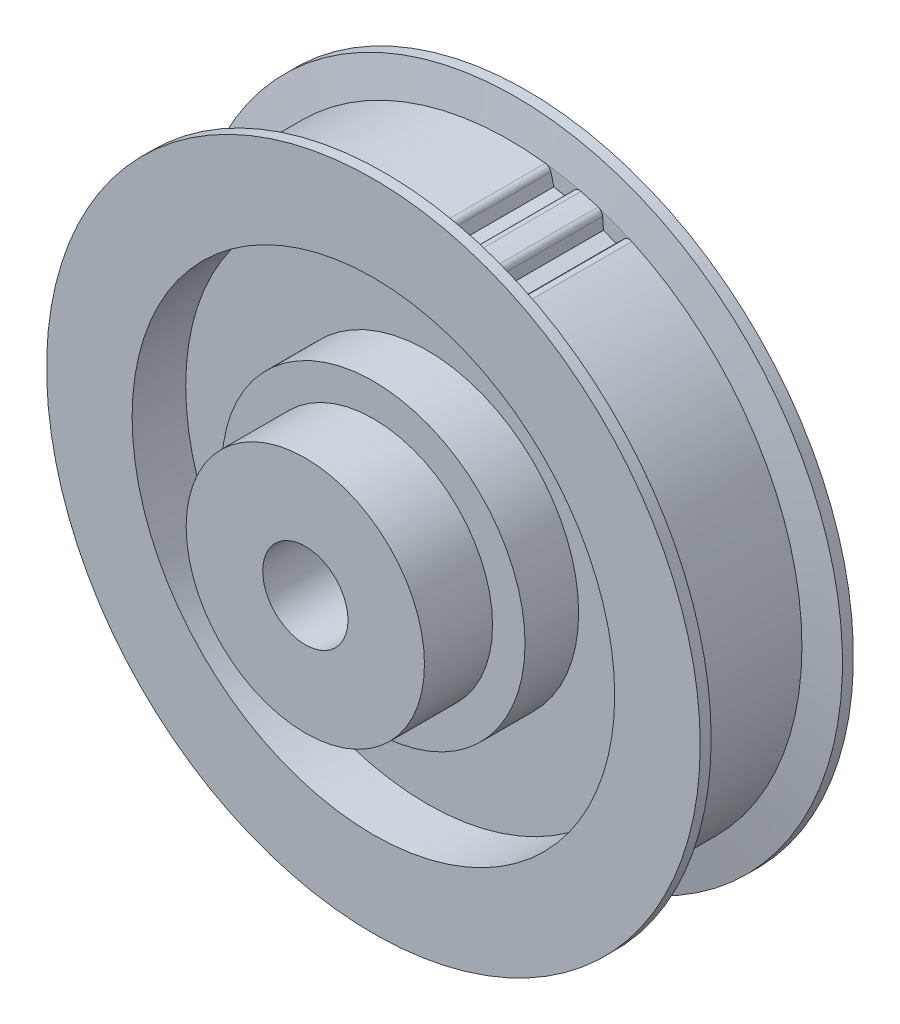
ISO-10303-21;
HEADER;
FILE_DESCRIPTION(('STEP AP214'),'2;1');
FILE_NAME('part.step','',(''),(''),'','','');
FILE_SCHEMA(('AUTOMOTIVE_DESIGN { 1 0 10303 214 1 1 1 1 }'));
ENDSEC;
DATA;
#1=APPLICATION_CONTEXT('core data for automotive mechanical design processes');
#2=APPLICATION_PROTOCOL_DEFINITION('international standard','automotive_design',2000,#1);
#3=PRODUCT_CONTEXT('',#1,'mechanical');
#4=PRODUCT('Part','Part','',(#3));
#5=PRODUCT_RELATED_PRODUCT_CATEGORY('part','',(#4));
#6=PRODUCT_DEFINITION_FORMATION('','',#4);
#7=PRODUCT_DEFINITION_CONTEXT('part definition',#1,'design');
#8=PRODUCT_DEFINITION('design','',#6,#7);
#9=PRODUCT_DEFINITION_SHAPE('','',#8);
#10=(LENGTH_UNIT() NAMED_UNIT(*) SI_UNIT(.MILLI.,.METRE.));
#11=(NAMED_UNIT(*) PLANE_ANGLE_UNIT() SI_UNIT($,.RADIAN.));
#12=(NAMED_UNIT(*) SI_UNIT($,.STERADIAN.) SOLID_ANGLE_UNIT());
#13=UNCERTAINTY_MEASURE_WITH_UNIT(LENGTH_MEASURE(1.E-05),#10,'distance_accuracy_value','');
#14=(GEOMETRIC_REPRESENTATION_CONTEXT(3) GLOBAL_UNCERTAINTY_ASSIGNED_CONTEXT((#13)) GLOBAL_UNIT_ASSIGNED_CONTEXT((#10,
#11,#12)) REPRESENTATION_CONTEXT('',''));
#15=CARTESIAN_POINT('',(0.,0.,0.));
#16=DIRECTION('',(0.,0.,1.));
#17=DIRECTION('',(1.,0.,0.));
#18=AXIS2_PLACEMENT_3D('',#15,#16,#17);
#19=CARTESIAN_POINT('',(0.,0.,-6.73508684388624));
#20=DIRECTION('',(0.,0.,1.));
#21=DIRECTION('',(1.,0.,0.));
#22=AXIS2_PLACEMENT_3D('',#19,#20,#21);
#23=CYLINDRICAL_SURFACE('',#22,27.2669);
#24=CARTESIAN_POINT('',(0.,0.,-5.55625));
#25=DIRECTION('',(0.,0.,1.));
#26=DIRECTION('',(1.,0.,0.));
#27=AXIS2_PLACEMENT_3D('',#24,#25,#26);
#28=CIRCLE('',#27,27.2669);
#29=CARTESIAN_POINT('',(8.25638364092266,25.9868421471985,-5.5562499999977));
#30=VERTEX_POINT('',#29);
#31=CARTESIAN_POINT('',(6.66059066724126,26.4408843946918,-5.55625));
#32=VERTEX_POINT('',#31);
#33=EDGE_CURVE('E275',#30,#32,#28,.T.);
#34=ORIENTED_EDGE('',*,*,#33,.T.);
#35=DIRECTION('',(0.,0.,1.));
#36=VECTOR('',#35,1.);
#37=CARTESIAN_POINT('',(6.66059066724126,26.4408843946918,-6.73508684388624));
#38=LINE('',#37,#36);
#39=CARTESIAN_POINT('',(6.66059066724329,26.4408843946999,5.55625000000076));
#40=VERTEX_POINT('',#39);
#41=EDGE_CURVE('E229',#32,#40,#38,.T.);
#42=ORIENTED_EDGE('',*,*,#41,.T.);
#43=CARTESIAN_POINT('',(0.,0.,5.55625));
#44=DIRECTION('',(0.,0.,1.));
#45=DIRECTION('',(1.,0.,0.));
#46=AXIS2_PLACEMENT_3D('',#43,#44,#45);
#47=CIRCLE('',#46,27.2669);
#48=CARTESIAN_POINT('',(8.2563836409254,25.9868421472071,5.55625));
#49=VERTEX_POINT('',#48);
#50=EDGE_CURVE('E277',#40,#49,#47,.F.);
#51=ORIENTED_EDGE('',*,*,#50,.T.);
#52=DIRECTION('',(0.,0.,1.));
#53=VECTOR('',#52,1.);
#54=CARTESIAN_POINT('',(8.2563836409254,25.9868421472071,-6.73508684388624));
#55=LINE('',#54,#53);
#56=EDGE_CURVE('E214',#49,#30,#55,.F.);
#57=ORIENTED_EDGE('',*,*,#56,.T.);
#58=EDGE_LOOP('',(#34,#42,#51,#57));
#59=FACE_BOUND('',#58,.T.);
#60=ADVANCED_FACE('F36',(#59),#23,.T.);
#61=CARTESIAN_POINT('',(6.0159422493335,26.204511819853,-5.55625));
#62=DIRECTION('',(0.813220272875712,-0.581956001587708,0.));
#63=DIRECTION('',(0.581956001587708,0.813220272875712,0.));
#64=AXIS2_PLACEMENT_3D('',#61,#62,#63);
#65=PLANE('',#64);
#66=DIRECTION('',(0.581956001587708,0.813220272875712,0.));
#67=VECTOR('',#66,1.);
#68=CARTESIAN_POINT('',(6.0159422493335,26.204511819853,5.55625));
#69=LINE('',#68,#67);
#70=CARTESIAN_POINT('',(6.01594224933983,26.2045118198618,5.55625));
#71=VERTEX_POINT('',#70);
#72=CARTESIAN_POINT('',(5.37776956926434,25.3127348476969,5.55625));
#73=VERTEX_POINT('',#72);
#74=EDGE_CURVE('E209',#71,#73,#69,.F.);
#75=ORIENTED_EDGE('',*,*,#74,.F.);
#76=DIRECTION('',(0.,0.,-1.));
#77=VECTOR('',#76,1.);
#78=CARTESIAN_POINT('',(6.01594224933983,26.2045118198618,-5.55625));
#79=LINE('',#78,#77);
#80=CARTESIAN_POINT('',(6.01594224933983,26.2045118198618,-5.55625));
#81=VERTEX_POINT('',#80);
#82=EDGE_CURVE('E223',#71,#81,#79,.T.);
#83=ORIENTED_EDGE('',*,*,#82,.T.);
#84=DIRECTION('',(0.581956001587708,0.813220272875712,0.));
#85=VECTOR('',#84,1.);
#86=CARTESIAN_POINT('',(6.0159422493335,26.204511819853,-5.55625));
#87=LINE('',#86,#85);
#88=CARTESIAN_POINT('',(5.37776956926434,25.3127348476969,-5.55625));
#89=VERTEX_POINT('',#88);
#90=EDGE_CURVE('E226',#89,#81,#87,.T.);
#91=ORIENTED_EDGE('',*,*,#90,.F.);
#92=DIRECTION('',(0.,0.,1.));
#93=VECTOR('',#92,1.);
#94=CARTESIAN_POINT('',(5.37776956926282,25.312734847698,-5.55625));
#95=LINE('',#94,#93);
#96=EDGE_CURVE('E177',#89,#73,#95,.T.);
#97=ORIENTED_EDGE('',*,*,#96,.T.);
#98=EDGE_LOOP('',(#75,#83,#91,#97));
#99=FACE_BOUND('',#98,.T.);
#100=ADVANCED_FACE('F290',(#99),#65,.F.);
#101=CARTESIAN_POINT('',(8.7531659144231,24.3523517854962,-5.55625));
#102=DIRECTION('',(-0.997774167736922,-0.0666836576448315,0.));
#103=DIRECTION('',(0.0666836576448315,-0.997774167736922,0.));
#104=AXIS2_PLACEMENT_3D('',#101,#102,#103);
#105=PLANE('',#104);
#106=DIRECTION('',(0.0666836576448315,-0.997774167736922,0.));
#107=VECTOR('',#106,1.);
#108=CARTESIAN_POINT('',(8.7531659144231,24.3523517854962,-5.55625));
#109=LINE('',#108,#107);
#110=CARTESIAN_POINT('',(8.68004064653338,25.4465104727388,-5.55625));
#111=VERTEX_POINT('',#110);
#112=CARTESIAN_POINT('',(8.75316591442325,24.3523517854966,-5.55625));
#113=VERTEX_POINT('',#112);
#114=EDGE_CURVE('E128',#111,#113,#109,.T.);
#115=ORIENTED_EDGE('',*,*,#114,.F.);
#116=DIRECTION('',(0.,0.,-1.));
#117=VECTOR('',#116,1.);
#118=CARTESIAN_POINT('',(8.68004064653338,25.4465104727388,5.55625));
#119=LINE('',#118,#117);
#120=CARTESIAN_POINT('',(8.68004064653338,25.4465104727388,5.55625));
#121=VERTEX_POINT('',#120);
#122=EDGE_CURVE('E211',#111,#121,#119,.F.);
#123=ORIENTED_EDGE('',*,*,#122,.T.);
#124=DIRECTION('',(0.0666836576448315,-0.997774167736922,0.));
#125=VECTOR('',#124,1.);
#126=CARTESIAN_POINT('',(8.7531659144231,24.3523517854962,5.55625));
#127=LINE('',#126,#125);
#128=CARTESIAN_POINT('',(8.75316591442325,24.3523517854966,5.55625));
#129=VERTEX_POINT('',#128);
#130=EDGE_CURVE('E188',#129,#121,#127,.F.);
#131=ORIENTED_EDGE('',*,*,#130,.F.);
#132=DIRECTION('',(0.,0.,1.));
#133=VECTOR('',#132,1.);
#134=CARTESIAN_POINT('',(8.75316591442355,24.3523517854974,-5.55625));
#135=LINE('',#134,#133);
#136=EDGE_CURVE('E173',#129,#113,#135,.F.);
#137=ORIENTED_EDGE('',*,*,#136,.T.);
#138=EDGE_LOOP('',(#115,#123,#131,#137));
#139=FACE_BOUND('',#138,.T.);
#140=ADVANCED_FACE('F287',(#139),#105,.F.);
#141=CARTESIAN_POINT('',(5.37776956926282,25.312734847698,-5.55625));
#142=DIRECTION('',(-0.183749517816599,-0.982973099683896,0.));
#143=DIRECTION('',(0.982973099683896,-0.183749517816599,0.));
#144=AXIS2_PLACEMENT_3D('',#141,#142,#143);
#145=PLANE('',#144);
#146=DIRECTION('',(-0.982973099685452,0.183749517808276,0.));
#147=VECTOR('',#146,1.);
#148=CARTESIAN_POINT('',(5.37776956926282,25.312734847698,5.55625));
#149=LINE('',#148,#147);
#150=CARTESIAN_POINT('',(4.12939373266414,25.5460967353142,5.55625));
#151=VERTEX_POINT('',#150);
#152=EDGE_CURVE('E176',#73,#151,#149,.T.);
#153=ORIENTED_EDGE('',*,*,#152,.F.);
#154=ORIENTED_EDGE('',*,*,#96,.F.);
#155=DIRECTION('',(0.982973099683896,-0.183749517816599,0.));
#156=VECTOR('',#155,1.);
#157=CARTESIAN_POINT('',(5.37776956926282,25.312734847698,-5.55625));
#158=LINE('',#157,#156);
#159=CARTESIAN_POINT('',(4.1293937326648,25.5460967353177,-5.55625));
#160=VERTEX_POINT('',#159);
#161=EDGE_CURVE('E185',#160,#89,#158,.T.);
#162=ORIENTED_EDGE('',*,*,#161,.F.);
#163=DIRECTION('',(0.,0.,1.));
#164=VECTOR('',#163,1.);
#165=CARTESIAN_POINT('',(4.12939373266414,25.5460967353142,-5.55625));
#166=LINE('',#165,#164);
#167=EDGE_CURVE('E168',#160,#151,#166,.T.);
#168=ORIENTED_EDGE('',*,*,#167,.T.);
#169=EDGE_LOOP('',(#153,#154,#162,#168));
#170=FACE_BOUND('',#169,.T.);
#171=ADVANCED_FACE('F289',(#170),#145,.F.);
#172=CARTESIAN_POINT('',(9.93740564576618,23.89357486944,-5.55625));
#173=DIRECTION('',(-0.361241666187179,-0.932472229404346,0.));
#174=DIRECTION('',(0.932472229404346,-0.361241666187179,0.));
#175=AXIS2_PLACEMENT_3D('',#172,#173,#174);
#176=PLANE('',#175);
#177=DIRECTION('',(-0.932472229404698,0.361241666186269,0.));
#178=VECTOR('',#177,1.);
#179=CARTESIAN_POINT('',(9.93740564576618,23.89357486944,5.55625));
#180=LINE('',#179,#178);
#181=CARTESIAN_POINT('',(9.93740564576796,23.8935748694386,5.55625));
#182=VERTEX_POINT('',#181);
#183=EDGE_CURVE('E141',#182,#129,#180,.T.);
#184=ORIENTED_EDGE('',*,*,#183,.F.);
#185=DIRECTION('',(0.,0.,1.));
#186=VECTOR('',#185,1.);
#187=CARTESIAN_POINT('',(9.93740564576784,23.8935748694382,-5.55625));
#188=LINE('',#187,#186);
#189=CARTESIAN_POINT('',(9.93740564576796,23.8935748694386,-5.55625));
#190=VERTEX_POINT('',#189);
#191=EDGE_CURVE('E138',#182,#190,#188,.F.);
#192=ORIENTED_EDGE('',*,*,#191,.T.);
#193=DIRECTION('',(-0.932472229404698,0.361241666186269,0.));
#194=VECTOR('',#193,1.);
#195=CARTESIAN_POINT('',(9.93740564576618,23.89357486944,-5.55625));
#196=LINE('',#195,#194);
#197=EDGE_CURVE('E121',#190,#113,#196,.T.);
#198=ORIENTED_EDGE('',*,*,#197,.T.);
#199=ORIENTED_EDGE('',*,*,#136,.F.);
#200=EDGE_LOOP('',(#184,#192,#198,#199));
#201=FACE_BOUND('',#200,.T.);
#202=ADVANCED_FACE('F139',(#201),#176,.F.);
#203=CARTESIAN_POINT('',(0.,0.,5.55625));
#204=DIRECTION('',(0.,0.,-1.));
#205=DIRECTION('',(-1.,0.,0.));
#206=AXIS2_PLACEMENT_3D('',#203,#204,#205);
#207=PLANE('',#206);
#208=DIRECTION('',(0.2488887638649,-0.968532076506401,0.));
#209=VECTOR('',#208,1.);
#210=CARTESIAN_POINT('',(4.12939373266414,25.5460967353142,5.55625));
#211=LINE('',#210,#209);
#212=CARTESIAN_POINT('',(3.85646243022268,26.608188558956,5.55625));
#213=VERTEX_POINT('',#212);
#214=EDGE_CURVE('E134',#151,#213,#211,.F.);
#215=ORIENTED_EDGE('',*,*,#214,.T.);
#216=CARTESIAN_POINT('',(3.26604527638438,26.4564659685039,5.55625));
#217=DIRECTION('',(0.,0.,-1.));
#218=DIRECTION('',(-1.,0.,0.));
#219=AXIS2_PLACEMENT_3D('',#216,#217,#218);
#220=CIRCLE('',#219,0.6096);
#221=CARTESIAN_POINT('',(3.34073330557278,27.0614732893654,5.55625));
#222=VERTEX_POINT('',#221);
#223=EDGE_CURVE('E243',#213,#222,#220,.F.);
#224=ORIENTED_EDGE('',*,*,#223,.T.);
#225=CARTESIAN_POINT('',(0.,0.,5.55625000000076));
#226=DIRECTION('',(0.,0.,1.));
#227=DIRECTION('',(1.,0.,0.));
#228=AXIS2_PLACEMENT_3D('',#225,#226,#227);
#229=CIRCLE('',#228,27.2669000000083);
#230=EDGE_CURVE('E145',#40,#222,#229,.T.);
#231=ORIENTED_EDGE('',*,*,#230,.F.);
#232=CARTESIAN_POINT('',(6.51168132768487,25.849751441294,5.55625));
#233=DIRECTION('',(0.,0.,-1.));
#234=DIRECTION('',(-1.,0.,0.));
#235=AXIS2_PLACEMENT_3D('',#232,#233,#234);
#236=CIRCLE('',#235,0.6096);
#237=EDGE_CURVE('E235',#40,#71,#236,.F.);
#238=ORIENTED_EDGE('',*,*,#237,.T.);
#239=ORIENTED_EDGE('',*,*,#74,.T.);
#240=ORIENTED_EDGE('',*,*,#152,.T.);
#241=EDGE_LOOP('',(#215,#224,#231,#238,#239,#240));
#242=FACE_BOUND('',#241,.T.);
#243=ADVANCED_FACE('F333',(#242),#207,.T.);
#244=CARTESIAN_POINT('',(0.,0.,5.55625));
#245=DIRECTION('',(0.,0.,-1.));
#246=DIRECTION('',(-1.,0.,0.));
#247=AXIS2_PLACEMENT_3D('',#244,#245,#246);
#248=PLANE('',#247);
#249=ORIENTED_EDGE('',*,*,#130,.T.);
#250=CARTESIAN_POINT('',(8.07179751388095,25.4058601150385,5.55625));
#251=DIRECTION('',(0.,0.,-1.));
#252=DIRECTION('',(-1.,0.,0.));
#253=AXIS2_PLACEMENT_3D('',#250,#251,#252);
#254=CIRCLE('',#253,0.6096);
#255=EDGE_CURVE('E218',#121,#49,#254,.F.);
#256=ORIENTED_EDGE('',*,*,#255,.T.);
#257=CARTESIAN_POINT('',(0.,0.,5.55624999999958));
#258=DIRECTION('',(0.,0.,1.));
#259=DIRECTION('',(1.,0.,0.));
#260=AXIS2_PLACEMENT_3D('',#257,#258,#259);
#261=CIRCLE('',#260,27.2669000000016);
#262=CARTESIAN_POINT('',(11.4056812120672,24.7667977683589,5.55624999999958));
#263=VERTEX_POINT('',#262);
#264=EDGE_CURVE('E270',#263,#49,#261,.T.);
#265=ORIENTED_EDGE('',*,*,#264,.F.);
#266=CARTESIAN_POINT('',(11.1506869418387,24.2130919961724,5.55625));
#267=DIRECTION('',(0.,0.,-1.));
#268=DIRECTION('',(-1.,0.,0.));
#269=AXIS2_PLACEMENT_3D('',#266,#267,#268);
#270=CIRCLE('',#269,0.6096);
#271=CARTESIAN_POINT('',(10.7285758118657,24.652903721747,5.55625));
#272=VERTEX_POINT('',#271);
#273=EDGE_CURVE('E12',#263,#272,#270,.F.);
#274=ORIENTED_EDGE('',*,*,#273,.T.);
#275=DIRECTION('',(0.721475927779859,0.69243951767226,0.));
#276=VECTOR('',#275,1.);
#277=CARTESIAN_POINT('',(10.7285758118657,24.652903721747,5.55625));
#278=LINE('',#277,#276);
#279=EDGE_CURVE('E146',#272,#182,#278,.F.);
#280=ORIENTED_EDGE('',*,*,#279,.T.);
#281=ORIENTED_EDGE('',*,*,#183,.T.);
#282=EDGE_LOOP('',(#249,#256,#265,#274,#280,#281));
#283=FACE_BOUND('',#282,.T.);
#284=ADVANCED_FACE('F260',(#283),#248,.T.);
#285=CARTESIAN_POINT('',(4.12939373266414,25.5460967353142,-5.55625));
#286=DIRECTION('',(-0.968532076506401,-0.2488887638649,0.));
#287=DIRECTION('',(0.2488887638649,-0.968532076506401,0.));
#288=AXIS2_PLACEMENT_3D('',#285,#286,#287);
#289=PLANE('',#288);
#290=DIRECTION('',(-0.248888763863599,0.968532076506736,0.));
#291=VECTOR('',#290,1.);
#292=CARTESIAN_POINT('',(4.12939373266414,25.5460967353142,-5.55625));
#293=LINE('',#292,#291);
#294=CARTESIAN_POINT('',(3.85646243022411,26.6081885589564,-5.55625));
#295=VERTEX_POINT('',#294);
#296=EDGE_CURVE('E133',#160,#295,#293,.T.);
#297=ORIENTED_EDGE('',*,*,#296,.T.);
#298=DIRECTION('',(0.,0.,-1.));
#299=VECTOR('',#298,1.);
#300=CARTESIAN_POINT('',(3.85646243022268,26.608188558956,5.55625));
#301=LINE('',#300,#299);
#302=EDGE_CURVE('E237',#295,#213,#301,.F.);
#303=ORIENTED_EDGE('',*,*,#302,.T.);
#304=ORIENTED_EDGE('',*,*,#214,.F.);
#305=ORIENTED_EDGE('',*,*,#167,.F.);
#306=EDGE_LOOP('',(#297,#303,#304,#305));
#307=FACE_BOUND('',#306,.T.);
#308=ADVANCED_FACE('F327',(#307),#289,.F.);
#309=CARTESIAN_POINT('',(0.,0.,-5.55625));
#310=DIRECTION('',(0.,0.,-1.));
#311=DIRECTION('',(-1.,0.,0.));
#312=AXIS2_PLACEMENT_3D('',#309,#310,#311);
#313=PLANE('',#312);
#314=CARTESIAN_POINT('',(0.,0.,-5.5562499999977));
#315=DIRECTION('',(0.,0.,-1.));
#316=DIRECTION('',(-1.,0.,0.));
#317=AXIS2_PLACEMENT_3D('',#314,#315,#316);
#318=CIRCLE('',#317,27.266899999991);
#319=CARTESIAN_POINT('',(11.4056812120665,24.7667977683574,-5.55625));
#320=VERTEX_POINT('',#319);
#321=EDGE_CURVE('E51',#30,#320,#318,.T.);
#322=ORIENTED_EDGE('',*,*,#321,.F.);
#323=CARTESIAN_POINT('',(8.07179751388095,25.4058601150385,-5.55625));
#324=DIRECTION('',(0.,0.,-1.));
#325=DIRECTION('',(-1.,0.,0.));
#326=AXIS2_PLACEMENT_3D('',#323,#324,#325);
#327=CIRCLE('',#326,0.6096);
#328=EDGE_CURVE('E221',#30,#111,#327,.T.);
#329=ORIENTED_EDGE('',*,*,#328,.T.);
#330=ORIENTED_EDGE('',*,*,#114,.T.);
#331=ORIENTED_EDGE('',*,*,#197,.F.);
#332=DIRECTION('',(0.721475927779859,0.69243951767226,0.));
#333=VECTOR('',#332,1.);
#334=CARTESIAN_POINT('',(10.7285758118657,24.652903721747,-5.55625));
#335=LINE('',#334,#333);
#336=CARTESIAN_POINT('',(10.7285758118657,24.652903721747,-5.55625));
#337=VERTEX_POINT('',#336);
#338=EDGE_CURVE('E126',#190,#337,#335,.T.);
#339=ORIENTED_EDGE('',*,*,#338,.T.);
#340=CARTESIAN_POINT('',(11.1506869418387,24.2130919961724,-5.55625));
#341=DIRECTION('',(0.,0.,-1.));
#342=DIRECTION('',(-1.,0.,0.));
#343=AXIS2_PLACEMENT_3D('',#340,#341,#342);
#344=CIRCLE('',#343,0.6096);
#345=EDGE_CURVE('E45',#337,#320,#344,.T.);
#346=ORIENTED_EDGE('',*,*,#345,.T.);
#347=EDGE_LOOP('',(#322,#329,#330,#331,#339,#346));
#348=FACE_BOUND('',#347,.T.);
#349=ADVANCED_FACE('F123',(#348),#313,.F.);
#350=CARTESIAN_POINT('',(0.,0.,-5.55625));
#351=DIRECTION('',(0.,0.,-1.));
#352=DIRECTION('',(-1.,0.,0.));
#353=AXIS2_PLACEMENT_3D('',#350,#351,#352);
#354=PLANE('',#353);
#355=ORIENTED_EDGE('',*,*,#296,.F.);
#356=ORIENTED_EDGE('',*,*,#161,.T.);
#357=ORIENTED_EDGE('',*,*,#90,.T.);
#358=CARTESIAN_POINT('',(6.51168132768487,25.849751441294,-5.55625));
#359=DIRECTION('',(0.,0.,-1.));
#360=DIRECTION('',(-1.,0.,0.));
#361=AXIS2_PLACEMENT_3D('',#358,#359,#360);
#362=CIRCLE('',#361,0.6096);
#363=EDGE_CURVE('E232',#81,#32,#362,.T.);
#364=ORIENTED_EDGE('',*,*,#363,.T.);
#365=CARTESIAN_POINT('',(0.,0.,-5.55624999999883));
#366=DIRECTION('',(0.,0.,-1.));
#367=DIRECTION('',(-1.,0.,0.));
#368=AXIS2_PLACEMENT_3D('',#365,#366,#367);
#369=CIRCLE('',#368,27.2668999999974);
#370=CARTESIAN_POINT('',(3.34073330557246,27.0614732893628,-5.55624999999883));
#371=VERTEX_POINT('',#370);
#372=EDGE_CURVE('E269',#371,#32,#369,.T.);
#373=ORIENTED_EDGE('',*,*,#372,.F.);
#374=CARTESIAN_POINT('',(3.26604527638438,26.4564659685039,-5.55625));
#375=DIRECTION('',(0.,0.,-1.));
#376=DIRECTION('',(-1.,0.,0.));
#377=AXIS2_PLACEMENT_3D('',#374,#375,#376);
#378=CIRCLE('',#377,0.6096);
#379=EDGE_CURVE('E246',#371,#295,#378,.T.);
#380=ORIENTED_EDGE('',*,*,#379,.T.);
#381=EDGE_LOOP('',(#355,#356,#357,#364,#373,#380));
#382=FACE_BOUND('',#381,.T.);
#383=ADVANCED_FACE('F321',(#382),#354,.F.);
#384=CARTESIAN_POINT('',(10.7285758118657,24.652903721747,-5.55625));
#385=DIRECTION('',(0.69243951767226,-0.721475927779859,0.));
#386=DIRECTION('',(0.721475927779859,0.69243951767226,0.));
#387=AXIS2_PLACEMENT_3D('',#384,#385,#386);
#388=PLANE('',#387);
#389=ORIENTED_EDGE('',*,*,#279,.F.);
#390=DIRECTION('',(0.,0.,-1.));
#391=VECTOR('',#390,1.);
#392=CARTESIAN_POINT('',(10.7285758118657,24.652903721747,-5.55625));
#393=LINE('',#392,#391);
#394=EDGE_CURVE('E151',#272,#337,#393,.T.);
#395=ORIENTED_EDGE('',*,*,#394,.T.);
#396=ORIENTED_EDGE('',*,*,#338,.F.);
#397=ORIENTED_EDGE('',*,*,#191,.F.);
#398=EDGE_LOOP('',(#389,#395,#396,#397));
#399=FACE_BOUND('',#398,.T.);
#400=ADVANCED_FACE('F149',(#399),#388,.F.);
#401=CARTESIAN_POINT('',(0.,0.,6.12280622171452));
#402=DIRECTION('',(0.,0.,1.));
#403=DIRECTION('',(1.,0.,0.));
#404=AXIS2_PLACEMENT_3D('',#401,#402,#403);
#405=CONICAL_SURFACE('',#404,30.4799999999999,1.3962634015952);
#406=CARTESIAN_POINT('',(0.,0.,6.12280622171401));
#407=DIRECTION('',(0.,0.,1.));
#408=DIRECTION('',(1.,0.,0.));
#409=AXIS2_PLACEMENT_3D('',#406,#407,#408);
#410=CIRCLE('',#409,30.48);
#411=CARTESIAN_POINT('',(30.48,0.,6.12280622171401));
#412=VERTEX_POINT('',#411);
#413=EDGE_CURVE('E632',#412,#412,#410,.T.);
#414=ORIENTED_EDGE('',*,*,#413,.F.);
#415=EDGE_LOOP('',(#414));
#416=FACE_BOUND('',#415,.T.);
#417=ORIENTED_EDGE('',*,*,#264,.T.);
#418=ORIENTED_EDGE('',*,*,#50,.F.);
#419=ORIENTED_EDGE('',*,*,#230,.T.);
#420=CARTESIAN_POINT('',(0.,0.,5.55625));
#421=DIRECTION('',(0.,0.,1.));
#422=DIRECTION('',(1.,0.,0.));
#423=AXIS2_PLACEMENT_3D('',#420,#421,#422);
#424=CIRCLE('',#423,27.2669);
#425=EDGE_CURVE('E253',#263,#222,#424,.F.);
#426=ORIENTED_EDGE('',*,*,#425,.F.);
#427=EDGE_LOOP('',(#417,#418,#419,#426));
#428=FACE_BOUND('',#427,.T.);
#429=ADVANCED_FACE('F311',(#416,#428),#405,.T.);
#430=CARTESIAN_POINT('',(0.,0.,-6.12280622171452));
#431=DIRECTION('',(0.,0.,-1.));
#432=DIRECTION('',(-1.,0.,0.));
#433=AXIS2_PLACEMENT_3D('',#430,#431,#432);
#434=CONICAL_SURFACE('',#433,30.4799999999999,1.3962634015952);
#435=CARTESIAN_POINT('',(0.,0.,-6.12280622171401));
#436=DIRECTION('',(0.,0.,-1.));
#437=DIRECTION('',(-1.,0.,0.));
#438=AXIS2_PLACEMENT_3D('',#435,#436,#437);
#439=CIRCLE('',#438,30.48);
#440=CARTESIAN_POINT('',(-30.48,0.,-6.12280622171401));
#441=VERTEX_POINT('',#440);
#442=EDGE_CURVE('E639',#441,#441,#439,.T.);
#443=ORIENTED_EDGE('',*,*,#442,.F.);
#444=EDGE_LOOP('',(#443));
#445=FACE_BOUND('',#444,.T.);
#446=ORIENTED_EDGE('',*,*,#372,.T.);
#447=ORIENTED_EDGE('',*,*,#33,.F.);
#448=ORIENTED_EDGE('',*,*,#321,.T.);
#449=CARTESIAN_POINT('',(0.,0.,-5.55625));
#450=DIRECTION('',(0.,0.,1.));
#451=DIRECTION('',(1.,0.,0.));
#452=AXIS2_PLACEMENT_3D('',#449,#450,#451);
#453=CIRCLE('',#452,27.2669);
#454=EDGE_CURVE('E215',#371,#320,#453,.T.);
#455=ORIENTED_EDGE('',*,*,#454,.F.);
#456=EDGE_LOOP('',(#446,#447,#448,#455));
#457=FACE_BOUND('',#456,.T.);
#458=ADVANCED_FACE('F280',(#445,#457),#434,.T.);
#459=CARTESIAN_POINT('',(0.,0.,-6.73508684388624));
#460=DIRECTION('',(0.,0.,1.));
#461=DIRECTION('',(1.,0.,0.));
#462=AXIS2_PLACEMENT_3D('',#459,#460,#461);
#463=CYLINDRICAL_SURFACE('',#462,27.2669);
#464=ORIENTED_EDGE('',*,*,#454,.T.);
#465=DIRECTION('',(0.,0.,1.));
#466=VECTOR('',#465,1.);
#467=CARTESIAN_POINT('',(11.4056812120665,24.7667977683574,-6.73508684388624));
#468=LINE('',#467,#466);
#469=EDGE_CURVE('E264',#320,#263,#468,.T.);
#470=ORIENTED_EDGE('',*,*,#469,.T.);
#471=ORIENTED_EDGE('',*,*,#425,.T.);
#472=DIRECTION('',(0.,0.,1.));
#473=VECTOR('',#472,1.);
#474=CARTESIAN_POINT('',(3.34073330557278,27.0614732893654,-6.73508684388624));
#475=LINE('',#474,#473);
#476=EDGE_CURVE('E240',#222,#371,#475,.F.);
#477=ORIENTED_EDGE('',*,*,#476,.T.);
#478=EDGE_LOOP('',(#464,#470,#471,#477));
#479=FACE_BOUND('',#478,.T.);
#480=ADVANCED_FACE('F300',(#479),#463,.T.);
#481=CARTESIAN_POINT('',(0.,0.,7.14375));
#482=DIRECTION('',(0.,0.,-1.));
#483=DIRECTION('',(-1.,0.,0.));
#484=AXIS2_PLACEMENT_3D('',#481,#482,#483);
#485=CYLINDRICAL_SURFACE('',#484,30.48);
#486=CARTESIAN_POINT('',(0.,0.,7.14375));
#487=DIRECTION('',(0.,0.,1.));
#488=DIRECTION('',(1.,0.,0.));
#489=AXIS2_PLACEMENT_3D('',#486,#487,#488);
#490=CIRCLE('',#489,30.48);
#491=CARTESIAN_POINT('',(30.48,0.,7.14375));
#492=VERTEX_POINT('',#491);
#493=EDGE_CURVE('E282',#492,#492,#490,.T.);
#494=ORIENTED_EDGE('',*,*,#493,.F.);
#495=EDGE_LOOP('',(#494));
#496=FACE_BOUND('',#495,.T.);
#497=ORIENTED_EDGE('',*,*,#413,.T.);
#498=EDGE_LOOP('',(#497));
#499=FACE_BOUND('',#498,.T.);
#500=ADVANCED_FACE('F302',(#496,#499),#485,.T.);
#501=CARTESIAN_POINT('',(0.,0.,7.14375));
#502=DIRECTION('',(0.,0.,1.));
#503=DIRECTION('',(1.,0.,0.));
#504=AXIS2_PLACEMENT_3D('',#501,#502,#503);
#505=PLANE('',#504);
#506=CARTESIAN_POINT('',(0.,0.,7.14375));
#507=DIRECTION('',(0.,0.,1.));
#508=DIRECTION('',(1.,0.,0.));
#509=AXIS2_PLACEMENT_3D('',#506,#507,#508);
#510=CIRCLE('',#509,22.5044);
#511=CARTESIAN_POINT('',(22.5044,0.,7.14375));
#512=VERTEX_POINT('',#511);
#513=EDGE_CURVE('E648',#512,#512,#510,.T.);
#514=ORIENTED_EDGE('',*,*,#513,.F.);
#515=EDGE_LOOP('',(#514));
#516=FACE_BOUND('',#515,.T.);
#517=ORIENTED_EDGE('',*,*,#493,.T.);
#518=EDGE_LOOP('',(#517));
#519=FACE_BOUND('',#518,.T.);
#520=ADVANCED_FACE('F308',(#516,#519),#505,.T.);
#521=CARTESIAN_POINT('',(0.,0.,-7.14375));
#522=DIRECTION('',(0.,0.,1.));
#523=DIRECTION('',(1.,0.,0.));
#524=AXIS2_PLACEMENT_3D('',#521,#522,#523);
#525=CYLINDRICAL_SURFACE('',#524,30.48);
#526=CARTESIAN_POINT('',(0.,0.,-7.14375));
#527=DIRECTION('',(0.,0.,-1.));
#528=DIRECTION('',(-1.,0.,0.));
#529=AXIS2_PLACEMENT_3D('',#526,#527,#528);
#530=CIRCLE('',#529,30.48);
#531=CARTESIAN_POINT('',(-30.48,0.,-7.14375));
#532=VERTEX_POINT('',#531);
#533=EDGE_CURVE('E636',#532,#532,#530,.T.);
#534=ORIENTED_EDGE('',*,*,#533,.F.);
#535=EDGE_LOOP('',(#534));
#536=FACE_BOUND('',#535,.T.);
#537=ORIENTED_EDGE('',*,*,#442,.T.);
#538=EDGE_LOOP('',(#537));
#539=FACE_BOUND('',#538,.T.);
#540=ADVANCED_FACE('F508',(#536,#539),#525,.T.);
#541=CARTESIAN_POINT('',(0.,0.,-7.14375));
#542=DIRECTION('',(0.,0.,-1.));
#543=DIRECTION('',(-1.,0.,0.));
#544=AXIS2_PLACEMENT_3D('',#541,#542,#543);
#545=PLANE('',#544);
#546=CARTESIAN_POINT('',(0.,0.,-7.14375));
#547=DIRECTION('',(0.,0.,-1.));
#548=DIRECTION('',(-1.,0.,0.));
#549=AXIS2_PLACEMENT_3D('',#546,#547,#548);
#550=CIRCLE('',#549,22.5044);
#551=CARTESIAN_POINT('',(-22.5044,0.,-7.14375));
#552=VERTEX_POINT('',#551);
#553=EDGE_CURVE('E654',#552,#552,#550,.T.);
#554=ORIENTED_EDGE('',*,*,#553,.F.);
#555=EDGE_LOOP('',(#554));
#556=FACE_BOUND('',#555,.T.);
#557=ORIENTED_EDGE('',*,*,#533,.T.);
#558=EDGE_LOOP('',(#557));
#559=FACE_BOUND('',#558,.T.);
#560=ADVANCED_FACE('F501',(#556,#559),#545,.T.);
#561=CARTESIAN_POINT('',(0.,0.,2.14312499999999));
#562=DIRECTION('',(0.,0.,-1.));
#563=DIRECTION('',(-1.,0.,0.));
#564=AXIS2_PLACEMENT_3D('',#561,#562,#563);
#565=PLANE('',#564);
#566=CARTESIAN_POINT('',(0.,0.,2.143125));
#567=DIRECTION('',(0.,0.,1.));
#568=DIRECTION('',(1.,0.,0.));
#569=AXIS2_PLACEMENT_3D('',#566,#567,#568);
#570=CIRCLE('',#569,14.14145);
#571=CARTESIAN_POINT('',(14.14145,0.,2.143125));
#572=VERTEX_POINT('',#571);
#573=EDGE_CURVE('E663',#572,#572,#570,.T.);
#574=ORIENTED_EDGE('',*,*,#573,.F.);
#575=EDGE_LOOP('',(#574));
#576=FACE_BOUND('',#575,.T.);
#577=CARTESIAN_POINT('',(0.,0.,2.14312499999999));
#578=DIRECTION('',(0.,0.,1.));
#579=DIRECTION('',(1.,0.,0.));
#580=AXIS2_PLACEMENT_3D('',#577,#578,#579);
#581=CIRCLE('',#580,22.5044);
#582=CARTESIAN_POINT('',(22.5044,0.,2.14312499999999));
#583=VERTEX_POINT('',#582);
#584=EDGE_CURVE('E643',#583,#583,#581,.T.);
#585=ORIENTED_EDGE('',*,*,#584,.T.);
#586=EDGE_LOOP('',(#585));
#587=FACE_BOUND('',#586,.T.);
#588=ADVANCED_FACE('F493',(#576,#587),#565,.F.);
#589=CARTESIAN_POINT('',(0.,0.,7.14375));
#590=DIRECTION('',(0.,0.,1.));
#591=DIRECTION('',(1.,0.,0.));
#592=AXIS2_PLACEMENT_3D('',#589,#590,#591);
#593=CYLINDRICAL_SURFACE('',#592,22.5044);
#594=ORIENTED_EDGE('',*,*,#584,.F.);
#595=EDGE_LOOP('',(#594));
#596=FACE_BOUND('',#595,.T.);
#597=ORIENTED_EDGE('',*,*,#513,.T.);
#598=EDGE_LOOP('',(#597));
#599=FACE_BOUND('',#598,.T.);
#600=ADVANCED_FACE('F485',(#596,#599),#593,.F.);
#601=CARTESIAN_POINT('',(0.,0.,-2.14312499999999));
#602=DIRECTION('',(0.,0.,1.));
#603=DIRECTION('',(1.,0.,0.));
#604=AXIS2_PLACEMENT_3D('',#601,#602,#603);
#605=PLANE('',#604);
#606=CARTESIAN_POINT('',(0.,0.,-2.143125));
#607=DIRECTION('',(0.,0.,1.));
#608=DIRECTION('',(1.,0.,0.));
#609=AXIS2_PLACEMENT_3D('',#606,#607,#608);
#610=CIRCLE('',#609,14.14145);
#611=CARTESIAN_POINT('',(14.14145,0.,-2.143125));
#612=VERTEX_POINT('',#611);
#613=EDGE_CURVE('E660',#612,#612,#610,.T.);
#614=ORIENTED_EDGE('',*,*,#613,.T.);
#615=EDGE_LOOP('',(#614));
#616=FACE_BOUND('',#615,.T.);
#617=CARTESIAN_POINT('',(0.,0.,-2.14312499999999));
#618=DIRECTION('',(0.,0.,-1.));
#619=DIRECTION('',(-1.,0.,0.));
#620=AXIS2_PLACEMENT_3D('',#617,#618,#619);
#621=CIRCLE('',#620,22.5044);
#622=CARTESIAN_POINT('',(-22.5044,0.,-2.14312499999999));
#623=VERTEX_POINT('',#622);
#624=EDGE_CURVE('E651',#623,#623,#621,.T.);
#625=ORIENTED_EDGE('',*,*,#624,.T.);
#626=EDGE_LOOP('',(#625));
#627=FACE_BOUND('',#626,.T.);
#628=ADVANCED_FACE('F477',(#616,#627),#605,.F.);
#629=CARTESIAN_POINT('',(0.,0.,-7.14375));
#630=DIRECTION('',(0.,0.,-1.));
#631=DIRECTION('',(-1.,0.,0.));
#632=AXIS2_PLACEMENT_3D('',#629,#630,#631);
#633=CYLINDRICAL_SURFACE('',#632,22.5044);
#634=ORIENTED_EDGE('',*,*,#624,.F.);
#635=EDGE_LOOP('',(#634));
#636=FACE_BOUND('',#635,.T.);
#637=ORIENTED_EDGE('',*,*,#553,.T.);
#638=EDGE_LOOP('',(#637));
#639=FACE_BOUND('',#638,.T.);
#640=ADVANCED_FACE('F468',(#636,#639),#633,.F.);
#641=CARTESIAN_POINT('',(0.,0.,-7.14375));
#642=DIRECTION('',(0.,0.,1.));
#643=DIRECTION('',(1.,0.,0.));
#644=AXIS2_PLACEMENT_3D('',#641,#642,#643);
#645=CYLINDRICAL_SURFACE('',#644,14.14145);
#646=CARTESIAN_POINT('',(0.,0.,-7.14375));
#647=DIRECTION('',(0.,0.,1.));
#648=DIRECTION('',(1.,0.,0.));
#649=AXIS2_PLACEMENT_3D('',#646,#647,#648);
#650=CIRCLE('',#649,14.14145);
#651=CARTESIAN_POINT('',(14.14145,0.,-7.14375));
#652=VERTEX_POINT('',#651);
#653=EDGE_CURVE('E657',#652,#652,#650,.T.);
#654=ORIENTED_EDGE('',*,*,#653,.T.);
#655=EDGE_LOOP('',(#654));
#656=FACE_BOUND('',#655,.T.);
#657=ORIENTED_EDGE('',*,*,#613,.F.);
#658=EDGE_LOOP('',(#657));
#659=FACE_BOUND('',#658,.T.);
#660=ADVANCED_FACE('F460',(#656,#659),#645,.T.);
#661=CARTESIAN_POINT('',(14.14145,0.,-7.14375));
#662=DIRECTION('',(0.,0.,-1.));
#663=DIRECTION('',(-1.,0.,0.));
#664=AXIS2_PLACEMENT_3D('',#661,#662,#663);
#665=PLANE('',#664);
#666=CARTESIAN_POINT('',(0.,0.,-7.14375));
#667=DIRECTION('',(0.,0.,-1.));
#668=DIRECTION('',(-1.,0.,0.));
#669=AXIS2_PLACEMENT_3D('',#666,#667,#668);
#670=CIRCLE('',#669,3.97510000000001);
#671=CARTESIAN_POINT('',(-3.97510000000001,0.,-7.14375));
#672=VERTEX_POINT('',#671);
#673=EDGE_CURVE('E678',#672,#672,#670,.T.);
#674=ORIENTED_EDGE('',*,*,#673,.F.);
#675=EDGE_LOOP('',(#674));
#676=FACE_BOUND('',#675,.T.);
#677=ORIENTED_EDGE('',*,*,#653,.F.);
#678=EDGE_LOOP('',(#677));
#679=FACE_BOUND('',#678,.T.);
#680=ADVANCED_FACE('F452',(#676,#679),#665,.T.);
#681=CARTESIAN_POINT('',(0.,0.,2.143125));
#682=DIRECTION('',(0.,0.,1.));
#683=DIRECTION('',(1.,0.,0.));
#684=AXIS2_PLACEMENT_3D('',#681,#682,#683);
#685=CYLINDRICAL_SURFACE('',#684,14.14145);
#686=ORIENTED_EDGE('',*,*,#573,.T.);
#687=EDGE_LOOP('',(#686));
#688=FACE_BOUND('',#687,.T.);
#689=CARTESIAN_POINT('',(0.,0.,7.14375));
#690=DIRECTION('',(0.,0.,1.));
#691=DIRECTION('',(1.,0.,0.));
#692=AXIS2_PLACEMENT_3D('',#689,#690,#691);
#693=CIRCLE('',#692,14.14145);
#694=CARTESIAN_POINT('',(14.14145,0.,7.14375));
#695=VERTEX_POINT('',#694);
#696=EDGE_CURVE('E672',#695,#695,#693,.T.);
#697=ORIENTED_EDGE('',*,*,#696,.F.);
#698=EDGE_LOOP('',(#697));
#699=FACE_BOUND('',#698,.T.);
#700=ADVANCED_FACE('F445',(#688,#699),#685,.T.);
#701=CARTESIAN_POINT('',(0.,0.,13.49375));
#702=DIRECTION('',(0.,0.,1.));
#703=DIRECTION('',(1.,0.,0.));
#704=AXIS2_PLACEMENT_3D('',#701,#702,#703);
#705=PLANE('',#704);
#706=CARTESIAN_POINT('',(0.,0.,13.49375));
#707=DIRECTION('',(0.,0.,-1.));
#708=DIRECTION('',(-1.,0.,0.));
#709=AXIS2_PLACEMENT_3D('',#706,#707,#708);
#710=CIRCLE('',#709,3.97510000000001);
#711=CARTESIAN_POINT('',(-3.97510000000001,0.,13.49375));
#712=VERTEX_POINT('',#711);
#713=EDGE_CURVE('E675',#712,#712,#710,.T.);
#714=ORIENTED_EDGE('',*,*,#713,.T.);
#715=EDGE_LOOP('',(#714));
#716=FACE_BOUND('',#715,.T.);
#717=CARTESIAN_POINT('',(0.,0.,13.49375));
#718=DIRECTION('',(0.,0.,1.));
#719=DIRECTION('',(1.,0.,0.));
#720=AXIS2_PLACEMENT_3D('',#717,#718,#719);
#721=CIRCLE('',#720,11.1125);
#722=CARTESIAN_POINT('',(11.1125,0.,13.49375));
#723=VERTEX_POINT('',#722);
#724=EDGE_CURVE('E666',#723,#723,#721,.T.);
#725=ORIENTED_EDGE('',*,*,#724,.T.);
#726=EDGE_LOOP('',(#725));
#727=FACE_BOUND('',#726,.T.);
#728=ADVANCED_FACE('F437',(#716,#727),#705,.T.);
#729=CARTESIAN_POINT('',(0.,0.,2.143125));
#730=DIRECTION('',(0.,0.,1.));
#731=DIRECTION('',(1.,0.,0.));
#732=AXIS2_PLACEMENT_3D('',#729,#730,#731);
#733=CYLINDRICAL_SURFACE('',#732,11.1125);
#734=CARTESIAN_POINT('',(0.,0.,7.14375));
#735=DIRECTION('',(0.,0.,1.));
#736=DIRECTION('',(1.,0.,0.));
#737=AXIS2_PLACEMENT_3D('',#734,#735,#736);
#738=CIRCLE('',#737,11.1125);
#739=CARTESIAN_POINT('',(11.1125,0.,7.14375));
#740=VERTEX_POINT('',#739);
#741=EDGE_CURVE('E669',#740,#740,#738,.T.);
#742=ORIENTED_EDGE('',*,*,#741,.T.);
#743=EDGE_LOOP('',(#742));
#744=FACE_BOUND('',#743,.T.);
#745=ORIENTED_EDGE('',*,*,#724,.F.);
#746=EDGE_LOOP('',(#745));
#747=FACE_BOUND('',#746,.T.);
#748=ADVANCED_FACE('F428',(#744,#747),#733,.T.);
#749=CARTESIAN_POINT('',(11.1125,0.,7.14375));
#750=DIRECTION('',(0.,0.,1.));
#751=DIRECTION('',(1.,0.,0.));
#752=AXIS2_PLACEMENT_3D('',#749,#750,#751);
#753=PLANE('',#752);
#754=ORIENTED_EDGE('',*,*,#696,.T.);
#755=EDGE_LOOP('',(#754));
#756=FACE_BOUND('',#755,.T.);
#757=ORIENTED_EDGE('',*,*,#741,.F.);
#758=EDGE_LOOP('',(#757));
#759=FACE_BOUND('',#758,.T.);
#760=ADVANCED_FACE('F419',(#756,#759),#753,.T.);
#761=CARTESIAN_POINT('',(0.,0.,-7.14375));
#762=DIRECTION('',(0.,0.,-1.));
#763=DIRECTION('',(-1.,0.,0.));
#764=AXIS2_PLACEMENT_3D('',#761,#762,#763);
#765=CYLINDRICAL_SURFACE('',#764,3.97510000000001);
#766=ORIENTED_EDGE('',*,*,#713,.F.);
#767=EDGE_LOOP('',(#766));
#768=FACE_BOUND('',#767,.T.);
#769=ORIENTED_EDGE('',*,*,#673,.T.);
#770=EDGE_LOOP('',(#769));
#771=FACE_BOUND('',#770,.T.);
#772=ADVANCED_FACE('F411',(#768,#771),#765,.F.);
#773=CARTESIAN_POINT('',(8.07179751388095,25.4058601150385,-6.73508684388624));
#774=DIRECTION('',(0.,0.,1.));
#775=DIRECTION('',(1.,0.,0.));
#776=AXIS2_PLACEMENT_3D('',#773,#774,#775);
#777=CYLINDRICAL_SURFACE('',#776,0.6096);
#778=ORIENTED_EDGE('',*,*,#328,.F.);
#779=ORIENTED_EDGE('',*,*,#56,.F.);
#780=ORIENTED_EDGE('',*,*,#255,.F.);
#781=ORIENTED_EDGE('',*,*,#122,.F.);
#782=EDGE_LOOP('',(#778,#779,#780,#781));
#783=FACE_BOUND('',#782,.T.);
#784=ADVANCED_FACE('F285',(#783),#777,.T.);
#785=CARTESIAN_POINT('',(6.51168132768487,25.849751441294,-6.73508684388624));
#786=DIRECTION('',(0.,0.,1.));
#787=DIRECTION('',(1.,0.,0.));
#788=AXIS2_PLACEMENT_3D('',#785,#786,#787);
#789=CYLINDRICAL_SURFACE('',#788,0.6096);
#790=ORIENTED_EDGE('',*,*,#237,.F.);
#791=ORIENTED_EDGE('',*,*,#41,.F.);
#792=ORIENTED_EDGE('',*,*,#363,.F.);
#793=ORIENTED_EDGE('',*,*,#82,.F.);
#794=EDGE_LOOP('',(#790,#791,#792,#793));
#795=FACE_BOUND('',#794,.T.);
#796=ADVANCED_FACE('F398',(#795),#789,.T.);
#797=CARTESIAN_POINT('',(3.26604527638438,26.4564659685039,-6.73508684388624));
#798=DIRECTION('',(0.,0.,1.));
#799=DIRECTION('',(1.,0.,0.));
#800=AXIS2_PLACEMENT_3D('',#797,#798,#799);
#801=CYLINDRICAL_SURFACE('',#800,0.6096);
#802=ORIENTED_EDGE('',*,*,#379,.F.);
#803=ORIENTED_EDGE('',*,*,#476,.F.);
#804=ORIENTED_EDGE('',*,*,#223,.F.);
#805=ORIENTED_EDGE('',*,*,#302,.F.);
#806=EDGE_LOOP('',(#802,#803,#804,#805));
#807=FACE_BOUND('',#806,.T.);
#808=ADVANCED_FACE('F390',(#807),#801,.T.);
#809=CARTESIAN_POINT('',(11.1506869418387,24.2130919961724,-6.73508684388624));
#810=DIRECTION('',(0.,0.,1.));
#811=DIRECTION('',(1.,0.,0.));
#812=AXIS2_PLACEMENT_3D('',#809,#810,#811);
#813=CYLINDRICAL_SURFACE('',#812,0.6096);
#814=ORIENTED_EDGE('',*,*,#273,.F.);
#815=ORIENTED_EDGE('',*,*,#469,.F.);
#816=ORIENTED_EDGE('',*,*,#345,.F.);
#817=ORIENTED_EDGE('',*,*,#394,.F.);
#818=EDGE_LOOP('',(#814,#815,#816,#817));
#819=FACE_BOUND('',#818,.T.);
#820=ADVANCED_FACE('F38',(#819),#813,.T.);
#821=CLOSED_SHELL('',(#60,#100,#140,#171,#202,#243,#284,#308,#349,#383,#400,#429,#458,#480,#500,
#520,#540,#560,#588,#600,#628,#640,#660,#680,#700,#728,#748,#760,#772,#784,#796,#808,#820));
#822=MANIFOLD_SOLID_BREP('B2',#821);
#823=ADVANCED_BREP_SHAPE_REPRESENTATION('',(#18,#822),#14);
#824=SHAPE_DEFINITION_REPRESENTATION(#9,#823);
ENDSEC;
END-ISO-10303-21;
